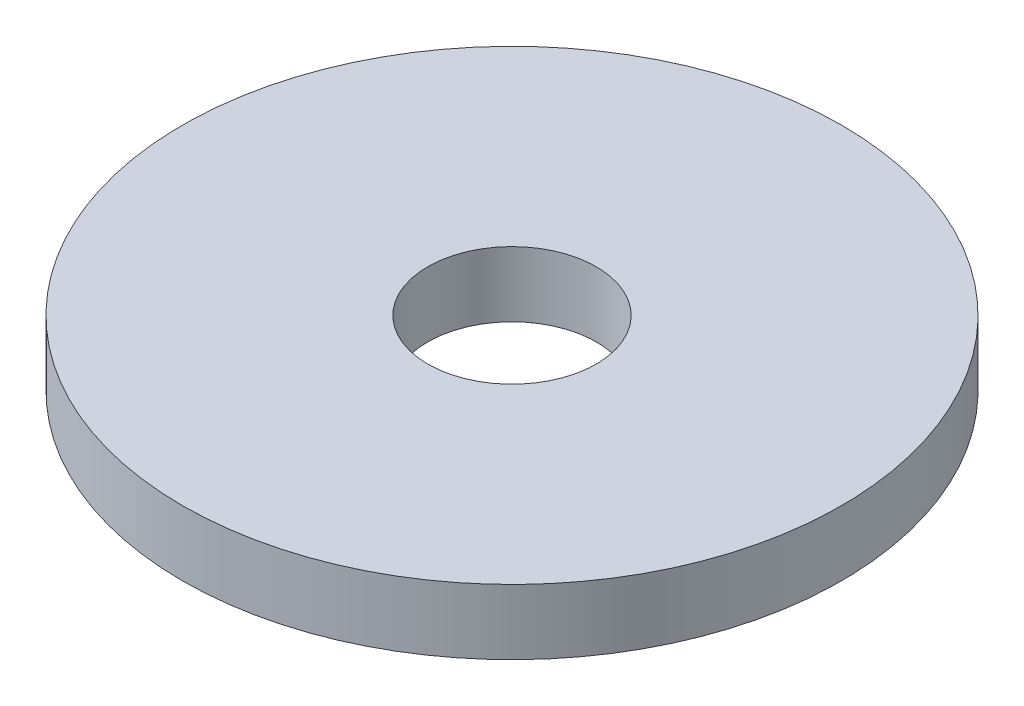
ISO-10303-21;
HEADER;
FILE_DESCRIPTION(('STEP AP214'),'2;1');
FILE_NAME('part.step','',(''),(''),'','','');
FILE_SCHEMA(('AUTOMOTIVE_DESIGN { 1 0 10303 214 1 1 1 1 }'));
ENDSEC;
DATA;
#1=APPLICATION_CONTEXT('core data for automotive mechanical design processes');
#2=APPLICATION_PROTOCOL_DEFINITION('international standard','automotive_design',2000,#1);
#3=PRODUCT_CONTEXT('',#1,'mechanical');
#4=PRODUCT('Part','Part','',(#3));
#5=PRODUCT_RELATED_PRODUCT_CATEGORY('part','',(#4));
#6=PRODUCT_DEFINITION_FORMATION('','',#4);
#7=PRODUCT_DEFINITION_CONTEXT('part definition',#1,'design');
#8=PRODUCT_DEFINITION('design','',#6,#7);
#9=PRODUCT_DEFINITION_SHAPE('','',#8);
#10=(LENGTH_UNIT() NAMED_UNIT(*) SI_UNIT(.MILLI.,.METRE.));
#11=(NAMED_UNIT(*) PLANE_ANGLE_UNIT() SI_UNIT($,.RADIAN.));
#12=(NAMED_UNIT(*) SI_UNIT($,.STERADIAN.) SOLID_ANGLE_UNIT());
#13=UNCERTAINTY_MEASURE_WITH_UNIT(LENGTH_MEASURE(1.E-05),#10,'distance_accuracy_value','');
#14=(GEOMETRIC_REPRESENTATION_CONTEXT(3) GLOBAL_UNCERTAINTY_ASSIGNED_CONTEXT((#13)) GLOBAL_UNIT_ASSIGNED_CONTEXT((#10,
#11,#12)) REPRESENTATION_CONTEXT('',''));
#15=CARTESIAN_POINT('',(0.,0.,0.));
#16=DIRECTION('',(0.,0.,1.));
#17=DIRECTION('',(1.,0.,0.));
#18=AXIS2_PLACEMENT_3D('',#15,#16,#17);
#19=CARTESIAN_POINT('',(0.,8.5,0.));
#20=DIRECTION('',(0.,1.,0.));
#21=DIRECTION('',(0.,0.,1.));
#22=AXIS2_PLACEMENT_3D('',#19,#20,#21);
#23=PLANE('',#22);
#24=CARTESIAN_POINT('',(0.,8.5,0.));
#25=DIRECTION('',(0.,1.,0.));
#26=DIRECTION('',(0.,0.,1.));
#27=AXIS2_PLACEMENT_3D('',#24,#25,#26);
#28=CIRCLE('',#27,43.);
#29=CARTESIAN_POINT('',(0.,8.5,43.));
#30=VERTEX_POINT('',#29);
#31=EDGE_CURVE('E10',#30,#30,#28,.T.);
#32=ORIENTED_EDGE('',*,*,#31,.T.);
#33=EDGE_LOOP('',(#32));
#34=FACE_BOUND('',#33,.T.);
#35=CARTESIAN_POINT('',(0.,8.5,0.));
#36=DIRECTION('',(0.,1.,0.));
#37=DIRECTION('',(0.,0.,1.));
#38=AXIS2_PLACEMENT_3D('',#35,#36,#37);
#39=CIRCLE('',#38,11.);
#40=CARTESIAN_POINT('',(0.,8.5,11.));
#41=VERTEX_POINT('',#40);
#42=EDGE_CURVE('E48',#41,#41,#39,.T.);
#43=ORIENTED_EDGE('',*,*,#42,.F.);
#44=EDGE_LOOP('',(#43));
#45=FACE_BOUND('',#44,.T.);
#46=ADVANCED_FACE('F37',(#34,#45),#23,.T.);
#47=CARTESIAN_POINT('',(0.,0.,0.));
#48=DIRECTION('',(0.,1.,0.));
#49=DIRECTION('',(0.,0.,1.));
#50=AXIS2_PLACEMENT_3D('',#47,#48,#49);
#51=PLANE('',#50);
#52=CARTESIAN_POINT('',(0.,0.,0.));
#53=DIRECTION('',(0.,1.,0.));
#54=DIRECTION('',(0.,0.,1.));
#55=AXIS2_PLACEMENT_3D('',#52,#53,#54);
#56=CIRCLE('',#55,43.);
#57=CARTESIAN_POINT('',(0.,0.,43.));
#58=VERTEX_POINT('',#57);
#59=EDGE_CURVE('E41',#58,#58,#56,.T.);
#60=ORIENTED_EDGE('',*,*,#59,.F.);
#61=EDGE_LOOP('',(#60));
#62=FACE_BOUND('',#61,.T.);
#63=CARTESIAN_POINT('',(0.,0.,0.));
#64=DIRECTION('',(0.,1.,0.));
#65=DIRECTION('',(0.,0.,1.));
#66=AXIS2_PLACEMENT_3D('',#63,#64,#65);
#67=CIRCLE('',#66,11.);
#68=CARTESIAN_POINT('',(0.,0.,11.));
#69=VERTEX_POINT('',#68);
#70=EDGE_CURVE('E50',#69,#69,#67,.T.);
#71=ORIENTED_EDGE('',*,*,#70,.T.);
#72=EDGE_LOOP('',(#71));
#73=FACE_BOUND('',#72,.T.);
#74=ADVANCED_FACE('F60',(#62,#73),#51,.F.);
#75=CARTESIAN_POINT('',(0.,8.5,0.));
#76=DIRECTION('',(0.,-1.,0.));
#77=DIRECTION('',(0.,0.,-1.));
#78=AXIS2_PLACEMENT_3D('',#75,#76,#77);
#79=CYLINDRICAL_SURFACE('',#78,43.);
#80=ORIENTED_EDGE('',*,*,#31,.F.);
#81=EDGE_LOOP('',(#80));
#82=FACE_BOUND('',#81,.T.);
#83=ORIENTED_EDGE('',*,*,#59,.T.);
#84=EDGE_LOOP('',(#83));
#85=FACE_BOUND('',#84,.T.);
#86=ADVANCED_FACE('F39',(#82,#85),#79,.T.);
#87=CARTESIAN_POINT('',(0.,8.5,0.));
#88=DIRECTION('',(0.,-1.,0.));
#89=DIRECTION('',(0.,0.,-1.));
#90=AXIS2_PLACEMENT_3D('',#87,#88,#89);
#91=CYLINDRICAL_SURFACE('',#90,11.);
#92=ORIENTED_EDGE('',*,*,#42,.T.);
#93=EDGE_LOOP('',(#92));
#94=FACE_BOUND('',#93,.T.);
#95=ORIENTED_EDGE('',*,*,#70,.F.);
#96=EDGE_LOOP('',(#95));
#97=FACE_BOUND('',#96,.T.);
#98=ADVANCED_FACE('F56',(#94,#97),#91,.F.);
#99=CLOSED_SHELL('',(#46,#74,#86,#98));
#100=MANIFOLD_SOLID_BREP('B2',#99);
#101=ADVANCED_BREP_SHAPE_REPRESENTATION('',(#18,#100),#14);
#102=SHAPE_DEFINITION_REPRESENTATION(#9,#101);
ENDSEC;
END-ISO-10303-21;
